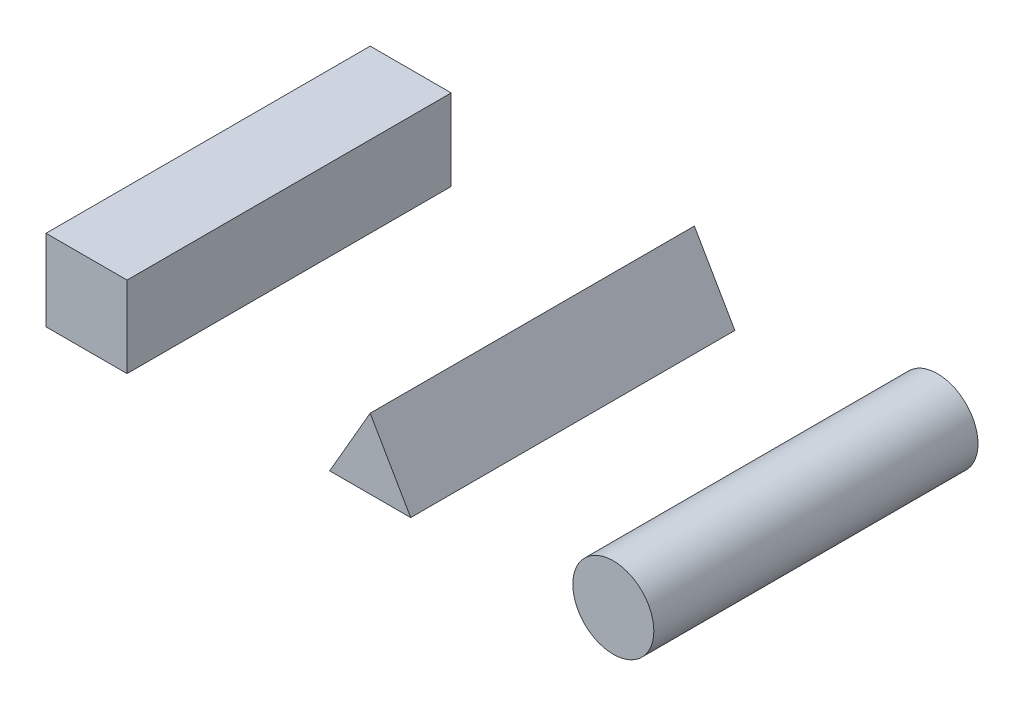
ISO-10303-21;
HEADER;
FILE_DESCRIPTION(('STEP AP214'),'2;1');
FILE_NAME('part.step','',(''),(''),'','','');
FILE_SCHEMA(('AUTOMOTIVE_DESIGN { 1 0 10303 214 1 1 1 1 }'));
ENDSEC;
DATA;
#1=APPLICATION_CONTEXT('core data for automotive mechanical design processes');
#2=APPLICATION_PROTOCOL_DEFINITION('international standard','automotive_design',2000,#1);
#3=PRODUCT_CONTEXT('',#1,'mechanical');
#4=PRODUCT('Part','Part','',(#3));
#5=PRODUCT_RELATED_PRODUCT_CATEGORY('part','',(#4));
#6=PRODUCT_DEFINITION_FORMATION('','',#4);
#7=PRODUCT_DEFINITION_CONTEXT('part definition',#1,'design');
#8=PRODUCT_DEFINITION('design','',#6,#7);
#9=PRODUCT_DEFINITION_SHAPE('','',#8);
#10=(LENGTH_UNIT() NAMED_UNIT(*) SI_UNIT(.MILLI.,.METRE.));
#11=(NAMED_UNIT(*) PLANE_ANGLE_UNIT() SI_UNIT($,.RADIAN.));
#12=(NAMED_UNIT(*) SI_UNIT($,.STERADIAN.) SOLID_ANGLE_UNIT());
#13=UNCERTAINTY_MEASURE_WITH_UNIT(LENGTH_MEASURE(1.E-05),#10,'distance_accuracy_value','');
#14=(GEOMETRIC_REPRESENTATION_CONTEXT(3) GLOBAL_UNCERTAINTY_ASSIGNED_CONTEXT((#13)) GLOBAL_UNIT_ASSIGNED_CONTEXT((#10,
#11,#12)) REPRESENTATION_CONTEXT('',''));
#15=CARTESIAN_POINT('',(0.,0.,0.));
#16=DIRECTION('',(0.,0.,1.));
#17=DIRECTION('',(1.,0.,0.));
#18=AXIS2_PLACEMENT_3D('',#15,#16,#17);
#19=CARTESIAN_POINT('',(60.,-2.60427151767759E-13,80.));
#20=DIRECTION('',(0.,0.,-1.));
#21=DIRECTION('',(-1.,0.,0.));
#22=AXIS2_PLACEMENT_3D('',#19,#20,#21);
#23=CYLINDRICAL_SURFACE('',#22,9.99999999999999);
#24=CARTESIAN_POINT('',(60.,-2.60427151767759E-13,80.));
#25=DIRECTION('',(0.,0.,1.));
#26=DIRECTION('',(1.,0.,0.));
#27=AXIS2_PLACEMENT_3D('',#24,#25,#26);
#28=CIRCLE('',#27,9.99999999999999);
#29=CARTESIAN_POINT('',(70.,-2.60427151767759E-13,80.));
#30=VERTEX_POINT('',#29);
#31=EDGE_CURVE('E11',#30,#30,#28,.T.);
#32=ORIENTED_EDGE('',*,*,#31,.F.);
#33=EDGE_LOOP('',(#32));
#34=FACE_BOUND('',#33,.T.);
#35=CARTESIAN_POINT('',(60.,-2.60427151767759E-13,0.));
#36=DIRECTION('',(0.,0.,1.));
#37=DIRECTION('',(1.,0.,0.));
#38=AXIS2_PLACEMENT_3D('',#35,#36,#37);
#39=CIRCLE('',#38,9.99999999999999);
#40=CARTESIAN_POINT('',(70.,-2.60427151767759E-13,0.));
#41=VERTEX_POINT('',#40);
#42=EDGE_CURVE('E53',#41,#41,#39,.T.);
#43=ORIENTED_EDGE('',*,*,#42,.T.);
#44=EDGE_LOOP('',(#43));
#45=FACE_BOUND('',#44,.T.);
#46=ADVANCED_FACE('F50',(#34,#45),#23,.T.);
#47=CARTESIAN_POINT('',(0.,0.,80.));
#48=DIRECTION('',(0.,0.,1.));
#49=DIRECTION('',(1.,0.,0.));
#50=AXIS2_PLACEMENT_3D('',#47,#48,#49);
#51=PLANE('',#50);
#52=ORIENTED_EDGE('',*,*,#31,.T.);
#53=EDGE_LOOP('',(#52));
#54=FACE_BOUND('',#53,.T.);
#55=ADVANCED_FACE('F65',(#54),#51,.T.);
#56=CARTESIAN_POINT('',(0.,0.,0.));
#57=DIRECTION('',(0.,0.,1.));
#58=DIRECTION('',(1.,0.,0.));
#59=AXIS2_PLACEMENT_3D('',#56,#57,#58);
#60=PLANE('',#59);
#61=ORIENTED_EDGE('',*,*,#42,.F.);
#62=EDGE_LOOP('',(#61));
#63=FACE_BOUND('',#62,.T.);
#64=ADVANCED_FACE('F63',(#63),#60,.F.);
#65=CLOSED_SHELL('',(#46,#55,#64));
#66=MANIFOLD_SOLID_BREP('B2',#65);
#67=CARTESIAN_POINT('',(-60.,0.,80.));
#68=DIRECTION('',(1.,0.,0.));
#69=DIRECTION('',(0.,1.,0.));
#70=AXIS2_PLACEMENT_3D('',#67,#68,#69);
#71=PLANE('',#70);
#72=DIRECTION('',(0.,-1.,0.));
#73=VECTOR('',#72,1.);
#74=CARTESIAN_POINT('',(-60.,0.,0.));
#75=LINE('',#74,#73);
#76=CARTESIAN_POINT('',(-60.,9.9999999999997,0.));
#77=VERTEX_POINT('',#76);
#78=CARTESIAN_POINT('',(-60.,-10.0000000000003,0.));
#79=VERTEX_POINT('',#78);
#80=EDGE_CURVE('E169',#77,#79,#75,.T.);
#81=ORIENTED_EDGE('',*,*,#80,.F.);
#82=DIRECTION('',(0.,0.,-1.));
#83=VECTOR('',#82,1.);
#84=CARTESIAN_POINT('',(-60.,9.9999999999997,80.));
#85=LINE('',#84,#83);
#86=CARTESIAN_POINT('',(-60.,9.9999999999997,80.));
#87=VERTEX_POINT('',#86);
#88=EDGE_CURVE('E48',#87,#77,#85,.T.);
#89=ORIENTED_EDGE('',*,*,#88,.F.);
#90=DIRECTION('',(0.,-1.,0.));
#91=VECTOR('',#90,1.);
#92=CARTESIAN_POINT('',(-60.,0.,80.));
#93=LINE('',#92,#91);
#94=CARTESIAN_POINT('',(-60.,-10.0000000000003,80.));
#95=VERTEX_POINT('',#94);
#96=EDGE_CURVE('E160',#87,#95,#93,.T.);
#97=ORIENTED_EDGE('',*,*,#96,.T.);
#98=DIRECTION('',(0.,0.,-1.));
#99=VECTOR('',#98,1.);
#100=CARTESIAN_POINT('',(-60.,-10.0000000000003,80.));
#101=LINE('',#100,#99);
#102=EDGE_CURVE('E139',#95,#79,#101,.T.);
#103=ORIENTED_EDGE('',*,*,#102,.T.);
#104=EDGE_LOOP('',(#81,#89,#97,#103));
#105=FACE_BOUND('',#104,.T.);
#106=ADVANCED_FACE('F100',(#105),#71,.T.);
#107=CARTESIAN_POINT('',(0.,9.99999999999973,80.));
#108=DIRECTION('',(0.,1.,0.));
#109=DIRECTION('',(-1.,0.,0.));
#110=AXIS2_PLACEMENT_3D('',#107,#108,#109);
#111=PLANE('',#110);
#112=DIRECTION('',(1.,0.,0.));
#113=VECTOR('',#112,1.);
#114=CARTESIAN_POINT('',(0.,9.99999999999973,0.));
#115=LINE('',#114,#113);
#116=CARTESIAN_POINT('',(-80.,9.99999999999969,0.));
#117=VERTEX_POINT('',#116);
#118=EDGE_CURVE('E152',#117,#77,#115,.T.);
#119=ORIENTED_EDGE('',*,*,#118,.F.);
#120=DIRECTION('',(0.,0.,-1.));
#121=VECTOR('',#120,1.);
#122=CARTESIAN_POINT('',(-80.,9.99999999999969,80.));
#123=LINE('',#122,#121);
#124=CARTESIAN_POINT('',(-80.,9.99999999999969,80.));
#125=VERTEX_POINT('',#124);
#126=EDGE_CURVE('E109',#125,#117,#123,.T.);
#127=ORIENTED_EDGE('',*,*,#126,.F.);
#128=DIRECTION('',(1.,0.,0.));
#129=VECTOR('',#128,1.);
#130=CARTESIAN_POINT('',(0.,9.99999999999973,80.));
#131=LINE('',#130,#129);
#132=EDGE_CURVE('E150',#125,#87,#131,.T.);
#133=ORIENTED_EDGE('',*,*,#132,.T.);
#134=ORIENTED_EDGE('',*,*,#88,.T.);
#135=EDGE_LOOP('',(#119,#127,#133,#134));
#136=FACE_BOUND('',#135,.T.);
#137=ADVANCED_FACE('F148',(#136),#111,.T.);
#138=CARTESIAN_POINT('',(-80.,-1.11022302462516E-13,80.));
#139=DIRECTION('',(1.,0.,0.));
#140=DIRECTION('',(0.,1.,0.));
#141=AXIS2_PLACEMENT_3D('',#138,#139,#140);
#142=PLANE('',#141);
#143=DIRECTION('',(0.,-1.,0.));
#144=VECTOR('',#143,1.);
#145=CARTESIAN_POINT('',(-80.,-1.11022302462516E-13,0.));
#146=LINE('',#145,#144);
#147=CARTESIAN_POINT('',(-80.,-10.0000000000003,0.));
#148=VERTEX_POINT('',#147);
#149=EDGE_CURVE('E132',#117,#148,#146,.T.);
#150=ORIENTED_EDGE('',*,*,#149,.T.);
#151=DIRECTION('',(0.,0.,-1.));
#152=VECTOR('',#151,1.);
#153=CARTESIAN_POINT('',(-80.,-10.0000000000003,80.));
#154=LINE('',#153,#152);
#155=CARTESIAN_POINT('',(-80.,-10.0000000000003,80.));
#156=VERTEX_POINT('',#155);
#157=EDGE_CURVE('E154',#156,#148,#154,.T.);
#158=ORIENTED_EDGE('',*,*,#157,.F.);
#159=DIRECTION('',(0.,-1.,0.));
#160=VECTOR('',#159,1.);
#161=CARTESIAN_POINT('',(-80.,-1.11022302462516E-13,80.));
#162=LINE('',#161,#160);
#163=EDGE_CURVE('E155',#125,#156,#162,.T.);
#164=ORIENTED_EDGE('',*,*,#163,.F.);
#165=ORIENTED_EDGE('',*,*,#126,.T.);
#166=EDGE_LOOP('',(#150,#158,#164,#165));
#167=FACE_BOUND('',#166,.T.);
#168=ADVANCED_FACE('F156',(#167),#142,.F.);
#169=CARTESIAN_POINT('',(0.,-10.0000000000003,80.));
#170=DIRECTION('',(0.,1.,0.));
#171=DIRECTION('',(-1.,0.,0.));
#172=AXIS2_PLACEMENT_3D('',#169,#170,#171);
#173=PLANE('',#172);
#174=DIRECTION('',(1.,0.,0.));
#175=VECTOR('',#174,1.);
#176=CARTESIAN_POINT('',(0.,-10.0000000000003,0.));
#177=LINE('',#176,#175);
#178=EDGE_CURVE('E164',#148,#79,#177,.T.);
#179=ORIENTED_EDGE('',*,*,#178,.T.);
#180=ORIENTED_EDGE('',*,*,#102,.F.);
#181=DIRECTION('',(1.,0.,0.));
#182=VECTOR('',#181,1.);
#183=CARTESIAN_POINT('',(0.,-10.0000000000003,80.));
#184=LINE('',#183,#182);
#185=EDGE_CURVE('E117',#156,#95,#184,.T.);
#186=ORIENTED_EDGE('',*,*,#185,.F.);
#187=ORIENTED_EDGE('',*,*,#157,.T.);
#188=EDGE_LOOP('',(#179,#180,#186,#187));
#189=FACE_BOUND('',#188,.T.);
#190=ADVANCED_FACE('F184',(#189),#173,.F.);
#191=CARTESIAN_POINT('',(0.,0.,80.));
#192=DIRECTION('',(0.,0.,1.));
#193=DIRECTION('',(1.,0.,0.));
#194=AXIS2_PLACEMENT_3D('',#191,#192,#193);
#195=PLANE('',#194);
#196=ORIENTED_EDGE('',*,*,#96,.F.);
#197=ORIENTED_EDGE('',*,*,#132,.F.);
#198=ORIENTED_EDGE('',*,*,#163,.T.);
#199=ORIENTED_EDGE('',*,*,#185,.T.);
#200=EDGE_LOOP('',(#196,#197,#198,#199));
#201=FACE_BOUND('',#200,.T.);
#202=ADVANCED_FACE('F159',(#201),#195,.T.);
#203=CARTESIAN_POINT('',(0.,0.,0.));
#204=DIRECTION('',(0.,0.,1.));
#205=DIRECTION('',(1.,0.,0.));
#206=AXIS2_PLACEMENT_3D('',#203,#204,#205);
#207=PLANE('',#206);
#208=ORIENTED_EDGE('',*,*,#80,.T.);
#209=ORIENTED_EDGE('',*,*,#178,.F.);
#210=ORIENTED_EDGE('',*,*,#149,.F.);
#211=ORIENTED_EDGE('',*,*,#118,.T.);
#212=EDGE_LOOP('',(#208,#209,#210,#211));
#213=FACE_BOUND('',#212,.T.);
#214=ADVANCED_FACE('F186',(#213),#207,.F.);
#215=CLOSED_SHELL('',(#106,#137,#168,#190,#202,#214));
#216=MANIFOLD_SOLID_BREP('B6',#215);
#217=CARTESIAN_POINT('',(0.,-5.77350269189655,80.));
#218=DIRECTION('',(0.,-1.,0.));
#219=DIRECTION('',(1.,0.,0.));
#220=AXIS2_PLACEMENT_3D('',#217,#218,#219);
#221=PLANE('',#220);
#222=DIRECTION('',(-1.,0.,0.));
#223=VECTOR('',#222,1.);
#224=CARTESIAN_POINT('',(0.,-5.77350269189655,0.));
#225=LINE('',#224,#223);
#226=CARTESIAN_POINT('',(10.,-5.77350269189654,0.));
#227=VERTEX_POINT('',#226);
#228=CARTESIAN_POINT('',(-10.,-5.77350269189655,0.));
#229=VERTEX_POINT('',#228);
#230=EDGE_CURVE('E270',#227,#229,#225,.T.);
#231=ORIENTED_EDGE('',*,*,#230,.F.);
#232=DIRECTION('',(0.,0.,-1.));
#233=VECTOR('',#232,1.);
#234=CARTESIAN_POINT('',(10.,-5.77350269189654,80.));
#235=LINE('',#234,#233);
#236=CARTESIAN_POINT('',(10.,-5.77350269189654,80.));
#237=VERTEX_POINT('',#236);
#238=EDGE_CURVE('E98',#237,#227,#235,.T.);
#239=ORIENTED_EDGE('',*,*,#238,.F.);
#240=DIRECTION('',(-1.,0.,0.));
#241=VECTOR('',#240,1.);
#242=CARTESIAN_POINT('',(0.,-5.77350269189655,80.));
#243=LINE('',#242,#241);
#244=CARTESIAN_POINT('',(-10.,-5.77350269189655,80.));
#245=VERTEX_POINT('',#244);
#246=EDGE_CURVE('E268',#237,#245,#243,.T.);
#247=ORIENTED_EDGE('',*,*,#246,.T.);
#248=DIRECTION('',(0.,0.,-1.));
#249=VECTOR('',#248,1.);
#250=CARTESIAN_POINT('',(-10.,-5.77350269189655,80.));
#251=LINE('',#250,#249);
#252=EDGE_CURVE('E252',#245,#229,#251,.T.);
#253=ORIENTED_EDGE('',*,*,#252,.T.);
#254=EDGE_LOOP('',(#231,#239,#247,#253));
#255=FACE_BOUND('',#254,.T.);
#256=ADVANCED_FACE('F236',(#255),#221,.T.);
#257=CARTESIAN_POINT('',(4.99999999999987,2.88675134594806,80.));
#258=DIRECTION('',(0.866025403784438,0.5,0.));
#259=DIRECTION('',(-0.5,0.866025403784438,0.));
#260=AXIS2_PLACEMENT_3D('',#257,#258,#259);
#261=PLANE('',#260);
#262=DIRECTION('',(0.5,-0.866025403784438,0.));
#263=VECTOR('',#262,1.);
#264=CARTESIAN_POINT('',(4.99999999999987,2.88675134594806,0.));
#265=LINE('',#264,#263);
#266=CARTESIAN_POINT('',(0.,11.5470053837922,0.));
#267=VERTEX_POINT('',#266);
#268=EDGE_CURVE('E286',#267,#227,#265,.T.);
#269=ORIENTED_EDGE('',*,*,#268,.F.);
#270=DIRECTION('',(0.,0.,-1.));
#271=VECTOR('',#270,1.);
#272=CARTESIAN_POINT('',(0.,11.5470053837922,80.));
#273=LINE('',#272,#271);
#274=CARTESIAN_POINT('',(0.,11.5470053837922,80.));
#275=VERTEX_POINT('',#274);
#276=EDGE_CURVE('E244',#275,#267,#273,.T.);
#277=ORIENTED_EDGE('',*,*,#276,.F.);
#278=DIRECTION('',(0.5,-0.866025403784438,0.));
#279=VECTOR('',#278,1.);
#280=CARTESIAN_POINT('',(4.99999999999987,2.88675134594806,80.));
#281=LINE('',#280,#279);
#282=EDGE_CURVE('E277',#275,#237,#281,.T.);
#283=ORIENTED_EDGE('',*,*,#282,.T.);
#284=ORIENTED_EDGE('',*,*,#238,.T.);
#285=EDGE_LOOP('',(#269,#277,#283,#284));
#286=FACE_BOUND('',#285,.T.);
#287=ADVANCED_FACE('F281',(#286),#261,.T.);
#288=CARTESIAN_POINT('',(-4.99999999999988,2.88675134594805,80.));
#289=DIRECTION('',(-0.866025403784439,0.5,0.));
#290=DIRECTION('',(-0.5,-0.866025403784439,0.));
#291=AXIS2_PLACEMENT_3D('',#288,#289,#290);
#292=PLANE('',#291);
#293=DIRECTION('',(0.5,0.866025403784439,0.));
#294=VECTOR('',#293,1.);
#295=CARTESIAN_POINT('',(-4.99999999999988,2.88675134594805,0.));
#296=LINE('',#295,#294);
#297=EDGE_CURVE('E279',#229,#267,#296,.T.);
#298=ORIENTED_EDGE('',*,*,#297,.F.);
#299=ORIENTED_EDGE('',*,*,#252,.F.);
#300=DIRECTION('',(0.5,0.866025403784439,0.));
#301=VECTOR('',#300,1.);
#302=CARTESIAN_POINT('',(-4.99999999999988,2.88675134594805,80.));
#303=LINE('',#302,#301);
#304=EDGE_CURVE('E278',#245,#275,#303,.T.);
#305=ORIENTED_EDGE('',*,*,#304,.T.);
#306=ORIENTED_EDGE('',*,*,#276,.T.);
#307=EDGE_LOOP('',(#298,#299,#305,#306));
#308=FACE_BOUND('',#307,.T.);
#309=ADVANCED_FACE('F292',(#308),#292,.T.);
#310=CARTESIAN_POINT('',(0.,0.,80.));
#311=DIRECTION('',(0.,0.,1.));
#312=DIRECTION('',(1.,0.,0.));
#313=AXIS2_PLACEMENT_3D('',#310,#311,#312);
#314=PLANE('',#313);
#315=ORIENTED_EDGE('',*,*,#246,.F.);
#316=ORIENTED_EDGE('',*,*,#282,.F.);
#317=ORIENTED_EDGE('',*,*,#304,.F.);
#318=EDGE_LOOP('',(#315,#316,#317));
#319=FACE_BOUND('',#318,.T.);
#320=ADVANCED_FACE('F276',(#319),#314,.T.);
#321=CARTESIAN_POINT('',(0.,0.,0.));
#322=DIRECTION('',(0.,0.,1.));
#323=DIRECTION('',(1.,0.,0.));
#324=AXIS2_PLACEMENT_3D('',#321,#322,#323);
#325=PLANE('',#324);
#326=ORIENTED_EDGE('',*,*,#230,.T.);
#327=ORIENTED_EDGE('',*,*,#297,.T.);
#328=ORIENTED_EDGE('',*,*,#268,.T.);
#329=EDGE_LOOP('',(#326,#327,#328));
#330=FACE_BOUND('',#329,.T.);
#331=ADVANCED_FACE('F291',(#330),#325,.F.);
#332=CLOSED_SHELL('',(#256,#287,#309,#320,#331));
#333=MANIFOLD_SOLID_BREP('B42',#332);
#334=ADVANCED_BREP_SHAPE_REPRESENTATION('',(#18,#66,#216,#333),#14);
#335=SHAPE_DEFINITION_REPRESENTATION(#9,#334);
ENDSEC;
END-ISO-10303-21;
